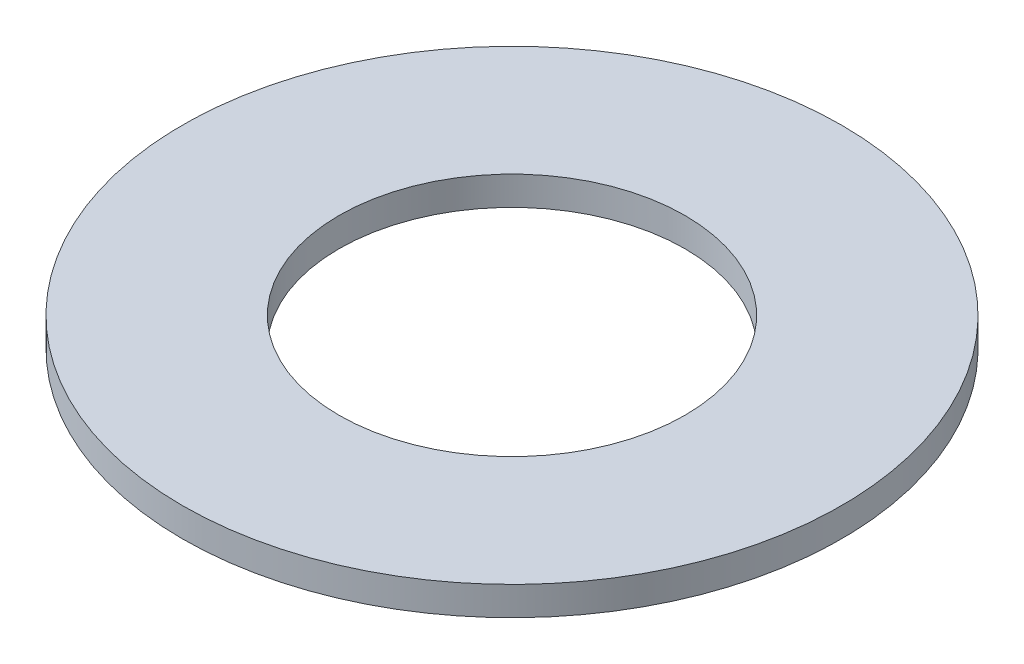
ISO-10303-21;
HEADER;
FILE_DESCRIPTION(('STEP AP214'),'2;1');
FILE_NAME('part.step','',(''),(''),'','','');
FILE_SCHEMA(('AUTOMOTIVE_DESIGN { 1 0 10303 214 1 1 1 1 }'));
ENDSEC;
DATA;
#1=APPLICATION_CONTEXT('core data for automotive mechanical design processes');
#2=APPLICATION_PROTOCOL_DEFINITION('international standard','automotive_design',2000,#1);
#3=PRODUCT_CONTEXT('',#1,'mechanical');
#4=PRODUCT('Part','Part','',(#3));
#5=PRODUCT_RELATED_PRODUCT_CATEGORY('part','',(#4));
#6=PRODUCT_DEFINITION_FORMATION('','',#4);
#7=PRODUCT_DEFINITION_CONTEXT('part definition',#1,'design');
#8=PRODUCT_DEFINITION('design','',#6,#7);
#9=PRODUCT_DEFINITION_SHAPE('','',#8);
#10=(LENGTH_UNIT() NAMED_UNIT(*) SI_UNIT(.MILLI.,.METRE.));
#11=(NAMED_UNIT(*) PLANE_ANGLE_UNIT() SI_UNIT($,.RADIAN.));
#12=(NAMED_UNIT(*) SI_UNIT($,.STERADIAN.) SOLID_ANGLE_UNIT());
#13=UNCERTAINTY_MEASURE_WITH_UNIT(LENGTH_MEASURE(1.E-05),#10,'distance_accuracy_value','');
#14=(GEOMETRIC_REPRESENTATION_CONTEXT(3) GLOBAL_UNCERTAINTY_ASSIGNED_CONTEXT((#13)) GLOBAL_UNIT_ASSIGNED_CONTEXT((#10,
#11,#12)) REPRESENTATION_CONTEXT('',''));
#15=CARTESIAN_POINT('',(0.,0.,0.));
#16=DIRECTION('',(0.,0.,1.));
#17=DIRECTION('',(1.,0.,0.));
#18=AXIS2_PLACEMENT_3D('',#15,#16,#17);
#19=CARTESIAN_POINT('',(0.,0.7,0.));
#20=DIRECTION('',(0.,1.,0.));
#21=DIRECTION('',(0.,0.,1.));
#22=AXIS2_PLACEMENT_3D('',#19,#20,#21);
#23=PLANE('',#22);
#24=CARTESIAN_POINT('',(0.,0.7,0.));
#25=DIRECTION('',(0.,1.,0.));
#26=DIRECTION('',(0.,0.,1.));
#27=AXIS2_PLACEMENT_3D('',#24,#25,#26);
#28=CIRCLE('',#27,8.);
#29=CARTESIAN_POINT('',(0.,0.7,8.));
#30=VERTEX_POINT('',#29);
#31=EDGE_CURVE('E10',#30,#30,#28,.T.);
#32=ORIENTED_EDGE('',*,*,#31,.T.);
#33=EDGE_LOOP('',(#32));
#34=FACE_BOUND('',#33,.T.);
#35=CARTESIAN_POINT('',(0.,0.7,0.));
#36=DIRECTION('',(0.,1.,0.));
#37=DIRECTION('',(0.,0.,1.));
#38=AXIS2_PLACEMENT_3D('',#35,#36,#37);
#39=CIRCLE('',#38,4.2);
#40=CARTESIAN_POINT('',(0.,0.7,4.2));
#41=VERTEX_POINT('',#40);
#42=EDGE_CURVE('E43',#41,#41,#39,.T.);
#43=ORIENTED_EDGE('',*,*,#42,.F.);
#44=EDGE_LOOP('',(#43));
#45=FACE_BOUND('',#44,.T.);
#46=ADVANCED_FACE('F32',(#34,#45),#23,.T.);
#47=CARTESIAN_POINT('',(0.,0.,0.));
#48=DIRECTION('',(0.,1.,0.));
#49=DIRECTION('',(0.,0.,1.));
#50=AXIS2_PLACEMENT_3D('',#47,#48,#49);
#51=PLANE('',#50);
#52=CARTESIAN_POINT('',(0.,0.,0.));
#53=DIRECTION('',(0.,1.,0.));
#54=DIRECTION('',(0.,0.,1.));
#55=AXIS2_PLACEMENT_3D('',#52,#53,#54);
#56=CIRCLE('',#55,8.);
#57=CARTESIAN_POINT('',(0.,0.,8.));
#58=VERTEX_POINT('',#57);
#59=EDGE_CURVE('E36',#58,#58,#56,.T.);
#60=ORIENTED_EDGE('',*,*,#59,.F.);
#61=EDGE_LOOP('',(#60));
#62=FACE_BOUND('',#61,.T.);
#63=CARTESIAN_POINT('',(0.,0.,0.));
#64=DIRECTION('',(0.,1.,0.));
#65=DIRECTION('',(0.,0.,1.));
#66=AXIS2_PLACEMENT_3D('',#63,#64,#65);
#67=CIRCLE('',#66,4.2);
#68=CARTESIAN_POINT('',(0.,0.,4.2));
#69=VERTEX_POINT('',#68);
#70=EDGE_CURVE('E45',#69,#69,#67,.T.);
#71=ORIENTED_EDGE('',*,*,#70,.T.);
#72=EDGE_LOOP('',(#71));
#73=FACE_BOUND('',#72,.T.);
#74=ADVANCED_FACE('F55',(#62,#73),#51,.F.);
#75=CARTESIAN_POINT('',(0.,0.7,0.));
#76=DIRECTION('',(0.,-1.,0.));
#77=DIRECTION('',(0.,0.,-1.));
#78=AXIS2_PLACEMENT_3D('',#75,#76,#77);
#79=CYLINDRICAL_SURFACE('',#78,8.);
#80=ORIENTED_EDGE('',*,*,#31,.F.);
#81=EDGE_LOOP('',(#80));
#82=FACE_BOUND('',#81,.T.);
#83=ORIENTED_EDGE('',*,*,#59,.T.);
#84=EDGE_LOOP('',(#83));
#85=FACE_BOUND('',#84,.T.);
#86=ADVANCED_FACE('F34',(#82,#85),#79,.T.);
#87=CARTESIAN_POINT('',(0.,0.7,0.));
#88=DIRECTION('',(0.,-1.,0.));
#89=DIRECTION('',(0.,0.,-1.));
#90=AXIS2_PLACEMENT_3D('',#87,#88,#89);
#91=CYLINDRICAL_SURFACE('',#90,4.2);
#92=ORIENTED_EDGE('',*,*,#42,.T.);
#93=EDGE_LOOP('',(#92));
#94=FACE_BOUND('',#93,.T.);
#95=ORIENTED_EDGE('',*,*,#70,.F.);
#96=EDGE_LOOP('',(#95));
#97=FACE_BOUND('',#96,.T.);
#98=ADVANCED_FACE('F51',(#94,#97),#91,.F.);
#99=CLOSED_SHELL('',(#46,#74,#86,#98));
#100=MANIFOLD_SOLID_BREP('B2',#99);
#101=ADVANCED_BREP_SHAPE_REPRESENTATION('',(#18,#100),#14);
#102=SHAPE_DEFINITION_REPRESENTATION(#9,#101);
ENDSEC;
END-ISO-10303-21;
